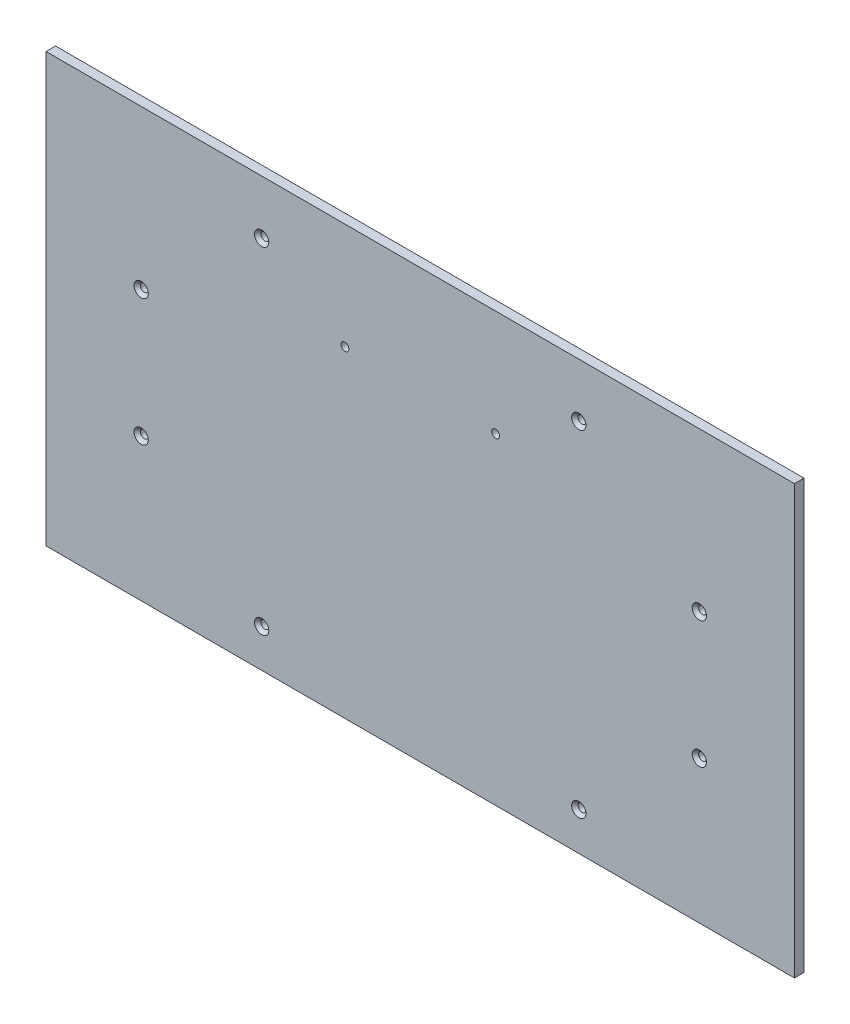
ISO-10303-21;
HEADER;
FILE_DESCRIPTION(('STEP AP214'),'2;1');
FILE_NAME('part.step','',(''),(''),'','','');
FILE_SCHEMA(('AUTOMOTIVE_DESIGN { 1 0 10303 214 1 1 1 1 }'));
ENDSEC;
DATA;
#1=APPLICATION_CONTEXT('core data for automotive mechanical design processes');
#2=APPLICATION_PROTOCOL_DEFINITION('international standard','automotive_design',2000,#1);
#3=PRODUCT_CONTEXT('',#1,'mechanical');
#4=PRODUCT('Part','Part','',(#3));
#5=PRODUCT_RELATED_PRODUCT_CATEGORY('part','',(#4));
#6=PRODUCT_DEFINITION_FORMATION('','',#4);
#7=PRODUCT_DEFINITION_CONTEXT('part definition',#1,'design');
#8=PRODUCT_DEFINITION('design','',#6,#7);
#9=PRODUCT_DEFINITION_SHAPE('','',#8);
#10=(LENGTH_UNIT() NAMED_UNIT(*) SI_UNIT(.MILLI.,.METRE.));
#11=(NAMED_UNIT(*) PLANE_ANGLE_UNIT() SI_UNIT($,.RADIAN.));
#12=(NAMED_UNIT(*) SI_UNIT($,.STERADIAN.) SOLID_ANGLE_UNIT());
#13=UNCERTAINTY_MEASURE_WITH_UNIT(LENGTH_MEASURE(1.E-05),#10,'distance_accuracy_value','');
#14=(GEOMETRIC_REPRESENTATION_CONTEXT(3) GLOBAL_UNCERTAINTY_ASSIGNED_CONTEXT((#13)) GLOBAL_UNIT_ASSIGNED_CONTEXT((#10,
#11,#12)) REPRESENTATION_CONTEXT('',''));
#15=CARTESIAN_POINT('',(0.,0.,0.));
#16=DIRECTION('',(0.,0.,1.));
#17=DIRECTION('',(1.,0.,0.));
#18=AXIS2_PLACEMENT_3D('',#15,#16,#17);
#19=CARTESIAN_POINT('',(236.,-135.,6.));
#20=DIRECTION('',(-1.,0.,0.));
#21=DIRECTION('',(0.,0.,1.));
#22=AXIS2_PLACEMENT_3D('',#19,#20,#21);
#23=PLANE('',#22);
#24=DIRECTION('',(0.,1.,0.));
#25=VECTOR('',#24,1.);
#26=CARTESIAN_POINT('',(236.,-135.,0.));
#27=LINE('',#26,#25);
#28=CARTESIAN_POINT('',(236.,-135.,0.));
#29=VERTEX_POINT('',#28);
#30=CARTESIAN_POINT('',(236.,135.,0.));
#31=VERTEX_POINT('',#30);
#32=EDGE_CURVE('E119',#29,#31,#27,.T.);
#33=ORIENTED_EDGE('',*,*,#32,.T.);
#34=DIRECTION('',(0.,0.,-1.));
#35=VECTOR('',#34,1.);
#36=CARTESIAN_POINT('',(236.,135.,6.));
#37=LINE('',#36,#35);
#38=CARTESIAN_POINT('',(236.,135.,6.));
#39=VERTEX_POINT('',#38);
#40=EDGE_CURVE('E107',#39,#31,#37,.T.);
#41=ORIENTED_EDGE('',*,*,#40,.F.);
#42=DIRECTION('',(0.,1.,0.));
#43=VECTOR('',#42,1.);
#44=CARTESIAN_POINT('',(236.,-135.,6.));
#45=LINE('',#44,#43);
#46=CARTESIAN_POINT('',(236.,-135.,6.));
#47=VERTEX_POINT('',#46);
#48=EDGE_CURVE('E99',#47,#39,#45,.T.);
#49=ORIENTED_EDGE('',*,*,#48,.F.);
#50=DIRECTION('',(0.,0.,-1.));
#51=VECTOR('',#50,1.);
#52=CARTESIAN_POINT('',(236.,-135.,6.));
#53=LINE('',#52,#51);
#54=EDGE_CURVE('E115',#47,#29,#53,.T.);
#55=ORIENTED_EDGE('',*,*,#54,.T.);
#56=EDGE_LOOP('',(#33,#41,#49,#55));
#57=FACE_BOUND('',#56,.T.);
#58=ADVANCED_FACE('F44',(#57),#23,.F.);
#59=CARTESIAN_POINT('',(-236.,135.,6.));
#60=DIRECTION('',(0.,-1.,0.));
#61=DIRECTION('',(0.,0.,-1.));
#62=AXIS2_PLACEMENT_3D('',#59,#60,#61);
#63=PLANE('',#62);
#64=DIRECTION('',(-1.,0.,0.));
#65=VECTOR('',#64,1.);
#66=CARTESIAN_POINT('',(-236.,135.,0.));
#67=LINE('',#66,#65);
#68=CARTESIAN_POINT('',(-236.,135.,0.));
#69=VERTEX_POINT('',#68);
#70=EDGE_CURVE('E105',#31,#69,#67,.T.);
#71=ORIENTED_EDGE('',*,*,#70,.T.);
#72=DIRECTION('',(0.,0.,-1.));
#73=VECTOR('',#72,1.);
#74=CARTESIAN_POINT('',(-236.,135.,6.));
#75=LINE('',#74,#73);
#76=CARTESIAN_POINT('',(-236.,135.,6.));
#77=VERTEX_POINT('',#76);
#78=EDGE_CURVE('E103',#77,#69,#75,.T.);
#79=ORIENTED_EDGE('',*,*,#78,.F.);
#80=DIRECTION('',(-1.,0.,0.));
#81=VECTOR('',#80,1.);
#82=CARTESIAN_POINT('',(-236.,135.,6.));
#83=LINE('',#82,#81);
#84=EDGE_CURVE('E94',#39,#77,#83,.T.);
#85=ORIENTED_EDGE('',*,*,#84,.F.);
#86=ORIENTED_EDGE('',*,*,#40,.T.);
#87=EDGE_LOOP('',(#71,#79,#85,#86));
#88=FACE_BOUND('',#87,.T.);
#89=ADVANCED_FACE('F104',(#88),#63,.F.);
#90=CARTESIAN_POINT('',(-236.,-135.,6.));
#91=DIRECTION('',(1.,0.,0.));
#92=DIRECTION('',(0.,0.,-1.));
#93=AXIS2_PLACEMENT_3D('',#90,#91,#92);
#94=PLANE('',#93);
#95=DIRECTION('',(0.,-1.,0.));
#96=VECTOR('',#95,1.);
#97=CARTESIAN_POINT('',(-236.,-135.,0.));
#98=LINE('',#97,#96);
#99=CARTESIAN_POINT('',(-236.,-135.,0.));
#100=VERTEX_POINT('',#99);
#101=EDGE_CURVE('E80',#69,#100,#98,.T.);
#102=ORIENTED_EDGE('',*,*,#101,.T.);
#103=DIRECTION('',(0.,0.,-1.));
#104=VECTOR('',#103,1.);
#105=CARTESIAN_POINT('',(-236.,-135.,6.));
#106=LINE('',#105,#104);
#107=CARTESIAN_POINT('',(-236.,-135.,6.));
#108=VERTEX_POINT('',#107);
#109=EDGE_CURVE('E108',#108,#100,#106,.T.);
#110=ORIENTED_EDGE('',*,*,#109,.F.);
#111=DIRECTION('',(0.,-1.,0.));
#112=VECTOR('',#111,1.);
#113=CARTESIAN_POINT('',(-236.,-135.,6.));
#114=LINE('',#113,#112);
#115=EDGE_CURVE('E97',#77,#108,#114,.T.);
#116=ORIENTED_EDGE('',*,*,#115,.F.);
#117=ORIENTED_EDGE('',*,*,#78,.T.);
#118=EDGE_LOOP('',(#102,#110,#116,#117));
#119=FACE_BOUND('',#118,.T.);
#120=ADVANCED_FACE('F110',(#119),#94,.F.);
#121=CARTESIAN_POINT('',(-236.,-135.,6.));
#122=DIRECTION('',(0.,1.,0.));
#123=DIRECTION('',(0.,0.,1.));
#124=AXIS2_PLACEMENT_3D('',#121,#122,#123);
#125=PLANE('',#124);
#126=DIRECTION('',(1.,0.,0.));
#127=VECTOR('',#126,1.);
#128=CARTESIAN_POINT('',(-236.,-135.,0.));
#129=LINE('',#128,#127);
#130=EDGE_CURVE('E86',#100,#29,#129,.T.);
#131=ORIENTED_EDGE('',*,*,#130,.T.);
#132=ORIENTED_EDGE('',*,*,#54,.F.);
#133=DIRECTION('',(1.,0.,0.));
#134=VECTOR('',#133,1.);
#135=CARTESIAN_POINT('',(-236.,-135.,6.));
#136=LINE('',#135,#134);
#137=EDGE_CURVE('E63',#108,#47,#136,.T.);
#138=ORIENTED_EDGE('',*,*,#137,.F.);
#139=ORIENTED_EDGE('',*,*,#109,.T.);
#140=EDGE_LOOP('',(#131,#132,#138,#139));
#141=FACE_BOUND('',#140,.T.);
#142=ADVANCED_FACE('F347',(#141),#125,.F.);
#143=CARTESIAN_POINT('',(0.,0.,6.));
#144=DIRECTION('',(0.,0.,-1.));
#145=DIRECTION('',(-1.,0.,0.));
#146=AXIS2_PLACEMENT_3D('',#143,#144,#145);
#147=PLANE('',#146);
#148=CARTESIAN_POINT('',(-47.5,68.,6.));
#149=DIRECTION('',(0.,0.,1.));
#150=DIRECTION('',(1.,0.,0.));
#151=AXIS2_PLACEMENT_3D('',#148,#149,#150);
#152=CIRCLE('',#151,2.5);
#153=CARTESIAN_POINT('',(-45.,68.,6.));
#154=VERTEX_POINT('',#153);
#155=EDGE_CURVE('E330',#154,#154,#152,.T.);
#156=ORIENTED_EDGE('',*,*,#155,.F.);
#157=EDGE_LOOP('',(#156));
#158=FACE_BOUND('',#157,.T.);
#159=CARTESIAN_POINT('',(47.5,68.,6.));
#160=DIRECTION('',(0.,0.,1.));
#161=DIRECTION('',(1.,0.,0.));
#162=AXIS2_PLACEMENT_3D('',#159,#160,#161);
#163=CIRCLE('',#162,2.5);
#164=CARTESIAN_POINT('',(50.,68.,6.));
#165=VERTEX_POINT('',#164);
#166=EDGE_CURVE('E327',#165,#165,#163,.T.);
#167=ORIENTED_EDGE('',*,*,#166,.F.);
#168=EDGE_LOOP('',(#167));
#169=FACE_BOUND('',#168,.T.);
#170=CARTESIAN_POINT('',(-176.,35.,6.));
#171=DIRECTION('',(0.,0.,-1.));
#172=DIRECTION('',(-1.,0.,0.));
#173=AXIS2_PLACEMENT_3D('',#170,#171,#172);
#174=CIRCLE('',#173,4.49999999999995);
#175=CARTESIAN_POINT('',(-180.5,35.,6.));
#176=VERTEX_POINT('',#175);
#177=EDGE_CURVE('E168',#176,#176,#174,.T.);
#178=ORIENTED_EDGE('',*,*,#177,.T.);
#179=EDGE_LOOP('',(#178));
#180=FACE_BOUND('',#179,.T.);
#181=CARTESIAN_POINT('',(-176.,-45.,6.));
#182=DIRECTION('',(0.,0.,-1.));
#183=DIRECTION('',(-1.,0.,0.));
#184=AXIS2_PLACEMENT_3D('',#181,#182,#183);
#185=CIRCLE('',#184,4.49999999999995);
#186=CARTESIAN_POINT('',(-180.5,-45.,6.));
#187=VERTEX_POINT('',#186);
#188=EDGE_CURVE('E164',#187,#187,#185,.T.);
#189=ORIENTED_EDGE('',*,*,#188,.T.);
#190=EDGE_LOOP('',(#189));
#191=FACE_BOUND('',#190,.T.);
#192=CARTESIAN_POINT('',(-99.9999999999999,-111.,6.));
#193=DIRECTION('',(0.,0.,-1.));
#194=DIRECTION('',(-1.,0.,0.));
#195=AXIS2_PLACEMENT_3D('',#192,#193,#194);
#196=CIRCLE('',#195,4.49999999999995);
#197=CARTESIAN_POINT('',(-104.5,-111.,6.));
#198=VERTEX_POINT('',#197);
#199=EDGE_CURVE('E160',#198,#198,#196,.T.);
#200=ORIENTED_EDGE('',*,*,#199,.T.);
#201=EDGE_LOOP('',(#200));
#202=FACE_BOUND('',#201,.T.);
#203=CARTESIAN_POINT('',(100.,-111.,6.));
#204=DIRECTION('',(0.,0.,-1.));
#205=DIRECTION('',(-1.,0.,0.));
#206=AXIS2_PLACEMENT_3D('',#203,#204,#205);
#207=CIRCLE('',#206,4.49999999999995);
#208=CARTESIAN_POINT('',(95.5000000000001,-111.,6.));
#209=VERTEX_POINT('',#208);
#210=EDGE_CURVE('E156',#209,#209,#207,.T.);
#211=ORIENTED_EDGE('',*,*,#210,.T.);
#212=EDGE_LOOP('',(#211));
#213=FACE_BOUND('',#212,.T.);
#214=CARTESIAN_POINT('',(176.,-45.,6.));
#215=DIRECTION('',(0.,0.,-1.));
#216=DIRECTION('',(-1.,0.,0.));
#217=AXIS2_PLACEMENT_3D('',#214,#215,#216);
#218=CIRCLE('',#217,4.49999999999995);
#219=CARTESIAN_POINT('',(171.5,-45.,6.));
#220=VERTEX_POINT('',#219);
#221=EDGE_CURVE('E152',#220,#220,#218,.T.);
#222=ORIENTED_EDGE('',*,*,#221,.T.);
#223=EDGE_LOOP('',(#222));
#224=FACE_BOUND('',#223,.T.);
#225=CARTESIAN_POINT('',(176.,35.,6.));
#226=DIRECTION('',(0.,0.,-1.));
#227=DIRECTION('',(-1.,0.,0.));
#228=AXIS2_PLACEMENT_3D('',#225,#226,#227);
#229=CIRCLE('',#228,4.49999999999995);
#230=CARTESIAN_POINT('',(171.5,35.,6.));
#231=VERTEX_POINT('',#230);
#232=EDGE_CURVE('E148',#231,#231,#229,.T.);
#233=ORIENTED_EDGE('',*,*,#232,.T.);
#234=EDGE_LOOP('',(#233));
#235=FACE_BOUND('',#234,.T.);
#236=CARTESIAN_POINT('',(100.,101.,6.));
#237=DIRECTION('',(0.,0.,-1.));
#238=DIRECTION('',(-1.,0.,0.));
#239=AXIS2_PLACEMENT_3D('',#236,#237,#238);
#240=CIRCLE('',#239,4.49999999999995);
#241=CARTESIAN_POINT('',(95.5000000000001,101.,6.));
#242=VERTEX_POINT('',#241);
#243=EDGE_CURVE('E144',#242,#242,#240,.T.);
#244=ORIENTED_EDGE('',*,*,#243,.T.);
#245=EDGE_LOOP('',(#244));
#246=FACE_BOUND('',#245,.T.);
#247=CARTESIAN_POINT('',(-100.,101.,6.));
#248=DIRECTION('',(0.,0.,-1.));
#249=DIRECTION('',(-1.,0.,0.));
#250=AXIS2_PLACEMENT_3D('',#247,#248,#249);
#251=CIRCLE('',#250,4.49999999999995);
#252=CARTESIAN_POINT('',(-104.5,101.,6.));
#253=VERTEX_POINT('',#252);
#254=EDGE_CURVE('E140',#253,#253,#251,.T.);
#255=ORIENTED_EDGE('',*,*,#254,.T.);
#256=EDGE_LOOP('',(#255));
#257=FACE_BOUND('',#256,.T.);
#258=ORIENTED_EDGE('',*,*,#48,.T.);
#259=ORIENTED_EDGE('',*,*,#84,.T.);
#260=ORIENTED_EDGE('',*,*,#115,.T.);
#261=ORIENTED_EDGE('',*,*,#137,.T.);
#262=EDGE_LOOP('',(#258,#259,#260,#261));
#263=FACE_BOUND('',#262,.T.);
#264=ADVANCED_FACE('F95',(#158,#169,#180,#191,#202,#213,#224,#235,#246,#257,#263),#147,.F.);
#265=CARTESIAN_POINT('',(0.,0.,0.));
#266=DIRECTION('',(0.,0.,-1.));
#267=DIRECTION('',(-1.,0.,0.));
#268=AXIS2_PLACEMENT_3D('',#265,#266,#267);
#269=PLANE('',#268);
#270=CARTESIAN_POINT('',(-47.5,68.,0.));
#271=DIRECTION('',(0.,0.,1.));
#272=DIRECTION('',(1.,0.,0.));
#273=AXIS2_PLACEMENT_3D('',#270,#271,#272);
#274=CIRCLE('',#273,2.5);
#275=CARTESIAN_POINT('',(-45.,68.,0.));
#276=VERTEX_POINT('',#275);
#277=EDGE_CURVE('E306',#276,#276,#274,.T.);
#278=ORIENTED_EDGE('',*,*,#277,.T.);
#279=EDGE_LOOP('',(#278));
#280=FACE_BOUND('',#279,.T.);
#281=CARTESIAN_POINT('',(47.5,68.,0.));
#282=DIRECTION('',(0.,0.,1.));
#283=DIRECTION('',(1.,0.,0.));
#284=AXIS2_PLACEMENT_3D('',#281,#282,#283);
#285=CIRCLE('',#284,2.5);
#286=CARTESIAN_POINT('',(50.,68.,0.));
#287=VERTEX_POINT('',#286);
#288=EDGE_CURVE('E324',#287,#287,#285,.T.);
#289=ORIENTED_EDGE('',*,*,#288,.T.);
#290=EDGE_LOOP('',(#289));
#291=FACE_BOUND('',#290,.T.);
#292=CARTESIAN_POINT('',(-176.,35.,0.));
#293=DIRECTION('',(0.,0.,1.));
#294=DIRECTION('',(1.,0.,0.));
#295=AXIS2_PLACEMENT_3D('',#292,#293,#294);
#296=CIRCLE('',#295,2.5);
#297=CARTESIAN_POINT('',(-173.5,35.,0.));
#298=VERTEX_POINT('',#297);
#299=EDGE_CURVE('E302',#298,#298,#296,.T.);
#300=ORIENTED_EDGE('',*,*,#299,.T.);
#301=EDGE_LOOP('',(#300));
#302=FACE_BOUND('',#301,.T.);
#303=CARTESIAN_POINT('',(-176.,-45.,0.));
#304=DIRECTION('',(0.,0.,1.));
#305=DIRECTION('',(1.,0.,0.));
#306=AXIS2_PLACEMENT_3D('',#303,#304,#305);
#307=CIRCLE('',#306,2.5);
#308=CARTESIAN_POINT('',(-173.5,-45.,0.));
#309=VERTEX_POINT('',#308);
#310=EDGE_CURVE('E298',#309,#309,#307,.T.);
#311=ORIENTED_EDGE('',*,*,#310,.T.);
#312=EDGE_LOOP('',(#311));
#313=FACE_BOUND('',#312,.T.);
#314=CARTESIAN_POINT('',(-99.9999999999999,-111.,0.));
#315=DIRECTION('',(0.,0.,1.));
#316=DIRECTION('',(1.,0.,0.));
#317=AXIS2_PLACEMENT_3D('',#314,#315,#316);
#318=CIRCLE('',#317,2.5);
#319=CARTESIAN_POINT('',(-97.4999999999999,-111.,0.));
#320=VERTEX_POINT('',#319);
#321=EDGE_CURVE('E291',#320,#320,#318,.T.);
#322=ORIENTED_EDGE('',*,*,#321,.T.);
#323=EDGE_LOOP('',(#322));
#324=FACE_BOUND('',#323,.T.);
#325=CARTESIAN_POINT('',(100.,-111.,0.));
#326=DIRECTION('',(0.,0.,1.));
#327=DIRECTION('',(1.,0.,0.));
#328=AXIS2_PLACEMENT_3D('',#325,#326,#327);
#329=CIRCLE('',#328,2.5);
#330=CARTESIAN_POINT('',(102.5,-111.,0.));
#331=VERTEX_POINT('',#330);
#332=EDGE_CURVE('E282',#331,#331,#329,.T.);
#333=ORIENTED_EDGE('',*,*,#332,.T.);
#334=EDGE_LOOP('',(#333));
#335=FACE_BOUND('',#334,.T.);
#336=CARTESIAN_POINT('',(176.,-45.,0.));
#337=DIRECTION('',(0.,0.,1.));
#338=DIRECTION('',(1.,0.,0.));
#339=AXIS2_PLACEMENT_3D('',#336,#337,#338);
#340=CIRCLE('',#339,2.5);
#341=CARTESIAN_POINT('',(178.5,-45.,0.));
#342=VERTEX_POINT('',#341);
#343=EDGE_CURVE('E278',#342,#342,#340,.T.);
#344=ORIENTED_EDGE('',*,*,#343,.T.);
#345=EDGE_LOOP('',(#344));
#346=FACE_BOUND('',#345,.T.);
#347=CARTESIAN_POINT('',(176.,35.,0.));
#348=DIRECTION('',(0.,0.,1.));
#349=DIRECTION('',(1.,0.,0.));
#350=AXIS2_PLACEMENT_3D('',#347,#348,#349);
#351=CIRCLE('',#350,2.5);
#352=CARTESIAN_POINT('',(178.5,35.,0.));
#353=VERTEX_POINT('',#352);
#354=EDGE_CURVE('E281',#353,#353,#351,.T.);
#355=ORIENTED_EDGE('',*,*,#354,.T.);
#356=EDGE_LOOP('',(#355));
#357=FACE_BOUND('',#356,.T.);
#358=CARTESIAN_POINT('',(100.,101.,0.));
#359=DIRECTION('',(0.,0.,1.));
#360=DIRECTION('',(1.,0.,0.));
#361=AXIS2_PLACEMENT_3D('',#358,#359,#360);
#362=CIRCLE('',#361,2.5);
#363=CARTESIAN_POINT('',(102.5,101.,0.));
#364=VERTEX_POINT('',#363);
#365=EDGE_CURVE('E288',#364,#364,#362,.T.);
#366=ORIENTED_EDGE('',*,*,#365,.T.);
#367=EDGE_LOOP('',(#366));
#368=FACE_BOUND('',#367,.T.);
#369=CARTESIAN_POINT('',(-100.,101.,0.));
#370=DIRECTION('',(0.,0.,1.));
#371=DIRECTION('',(1.,0.,0.));
#372=AXIS2_PLACEMENT_3D('',#369,#370,#371);
#373=CIRCLE('',#372,2.5);
#374=CARTESIAN_POINT('',(-97.5,101.,0.));
#375=VERTEX_POINT('',#374);
#376=EDGE_CURVE('E123',#375,#375,#373,.T.);
#377=ORIENTED_EDGE('',*,*,#376,.T.);
#378=EDGE_LOOP('',(#377));
#379=FACE_BOUND('',#378,.T.);
#380=ORIENTED_EDGE('',*,*,#32,.F.);
#381=ORIENTED_EDGE('',*,*,#130,.F.);
#382=ORIENTED_EDGE('',*,*,#101,.F.);
#383=ORIENTED_EDGE('',*,*,#70,.F.);
#384=EDGE_LOOP('',(#380,#381,#382,#383));
#385=FACE_BOUND('',#384,.T.);
#386=ADVANCED_FACE('F336',(#280,#291,#302,#313,#324,#335,#346,#357,#368,#379,#385),#269,.T.);
#387=CARTESIAN_POINT('',(-100.,101.,0.));
#388=DIRECTION('',(0.,0.,1.));
#389=DIRECTION('',(1.,0.,0.));
#390=AXIS2_PLACEMENT_3D('',#387,#388,#389);
#391=CYLINDRICAL_SURFACE('',#390,2.5);
#392=CARTESIAN_POINT('',(-100.,101.,4.00000000000004));
#393=DIRECTION('',(0.,0.,-1.));
#394=DIRECTION('',(-1.,0.,0.));
#395=AXIS2_PLACEMENT_3D('',#392,#393,#394);
#396=CIRCLE('',#395,2.5);
#397=CARTESIAN_POINT('',(-102.5,101.,4.00000000000004));
#398=VERTEX_POINT('',#397);
#399=EDGE_CURVE('E11',#398,#398,#396,.F.);
#400=ORIENTED_EDGE('',*,*,#399,.T.);
#401=EDGE_LOOP('',(#400));
#402=FACE_BOUND('',#401,.T.);
#403=ORIENTED_EDGE('',*,*,#376,.F.);
#404=EDGE_LOOP('',(#403));
#405=FACE_BOUND('',#404,.T.);
#406=ADVANCED_FACE('F367',(#402,#405),#391,.F.);
#407=CARTESIAN_POINT('',(100.,101.,0.));
#408=DIRECTION('',(0.,0.,1.));
#409=DIRECTION('',(1.,0.,0.));
#410=AXIS2_PLACEMENT_3D('',#407,#408,#409);
#411=CYLINDRICAL_SURFACE('',#410,2.5);
#412=CARTESIAN_POINT('',(100.,101.,4.00000000000004));
#413=DIRECTION('',(0.,0.,-1.));
#414=DIRECTION('',(-1.,0.,0.));
#415=AXIS2_PLACEMENT_3D('',#412,#413,#414);
#416=CIRCLE('',#415,2.5);
#417=CARTESIAN_POINT('',(97.5,101.,4.00000000000004));
#418=VERTEX_POINT('',#417);
#419=EDGE_CURVE('E55',#418,#418,#416,.F.);
#420=ORIENTED_EDGE('',*,*,#419,.T.);
#421=EDGE_LOOP('',(#420));
#422=FACE_BOUND('',#421,.T.);
#423=ORIENTED_EDGE('',*,*,#365,.F.);
#424=EDGE_LOOP('',(#423));
#425=FACE_BOUND('',#424,.T.);
#426=ADVANCED_FACE('F196',(#422,#425),#411,.F.);
#427=CARTESIAN_POINT('',(176.,35.,0.));
#428=DIRECTION('',(0.,0.,1.));
#429=DIRECTION('',(1.,0.,0.));
#430=AXIS2_PLACEMENT_3D('',#427,#428,#429);
#431=CYLINDRICAL_SURFACE('',#430,2.5);
#432=CARTESIAN_POINT('',(176.,35.,4.00000000000004));
#433=DIRECTION('',(0.,0.,-1.));
#434=DIRECTION('',(-1.,0.,0.));
#435=AXIS2_PLACEMENT_3D('',#432,#433,#434);
#436=CIRCLE('',#435,2.5);
#437=CARTESIAN_POINT('',(173.5,35.,4.00000000000004));
#438=VERTEX_POINT('',#437);
#439=EDGE_CURVE('E188',#438,#438,#436,.F.);
#440=ORIENTED_EDGE('',*,*,#439,.T.);
#441=EDGE_LOOP('',(#440));
#442=FACE_BOUND('',#441,.T.);
#443=ORIENTED_EDGE('',*,*,#354,.F.);
#444=EDGE_LOOP('',(#443));
#445=FACE_BOUND('',#444,.T.);
#446=ADVANCED_FACE('F274',(#442,#445),#431,.F.);
#447=CARTESIAN_POINT('',(176.,-45.,0.));
#448=DIRECTION('',(0.,0.,1.));
#449=DIRECTION('',(1.,0.,0.));
#450=AXIS2_PLACEMENT_3D('',#447,#448,#449);
#451=CYLINDRICAL_SURFACE('',#450,2.5);
#452=CARTESIAN_POINT('',(176.,-45.,4.00000000000004));
#453=DIRECTION('',(0.,0.,-1.));
#454=DIRECTION('',(-1.,0.,0.));
#455=AXIS2_PLACEMENT_3D('',#452,#453,#454);
#456=CIRCLE('',#455,2.5);
#457=CARTESIAN_POINT('',(173.5,-45.,4.00000000000004));
#458=VERTEX_POINT('',#457);
#459=EDGE_CURVE('E184',#458,#458,#456,.F.);
#460=ORIENTED_EDGE('',*,*,#459,.T.);
#461=EDGE_LOOP('',(#460));
#462=FACE_BOUND('',#461,.T.);
#463=ORIENTED_EDGE('',*,*,#343,.F.);
#464=EDGE_LOOP('',(#463));
#465=FACE_BOUND('',#464,.T.);
#466=ADVANCED_FACE('F270',(#462,#465),#451,.F.);
#467=CARTESIAN_POINT('',(100.,-111.,0.));
#468=DIRECTION('',(0.,0.,1.));
#469=DIRECTION('',(1.,0.,0.));
#470=AXIS2_PLACEMENT_3D('',#467,#468,#469);
#471=CYLINDRICAL_SURFACE('',#470,2.5);
#472=CARTESIAN_POINT('',(100.,-111.,4.00000000000004));
#473=DIRECTION('',(0.,0.,-1.));
#474=DIRECTION('',(-1.,0.,0.));
#475=AXIS2_PLACEMENT_3D('',#472,#473,#474);
#476=CIRCLE('',#475,2.5);
#477=CARTESIAN_POINT('',(97.5,-111.,4.00000000000004));
#478=VERTEX_POINT('',#477);
#479=EDGE_CURVE('E180',#478,#478,#476,.F.);
#480=ORIENTED_EDGE('',*,*,#479,.T.);
#481=EDGE_LOOP('',(#480));
#482=FACE_BOUND('',#481,.T.);
#483=ORIENTED_EDGE('',*,*,#332,.F.);
#484=EDGE_LOOP('',(#483));
#485=FACE_BOUND('',#484,.T.);
#486=ADVANCED_FACE('F273',(#482,#485),#471,.F.);
#487=CARTESIAN_POINT('',(-99.9999999999999,-111.,0.));
#488=DIRECTION('',(0.,0.,1.));
#489=DIRECTION('',(1.,0.,0.));
#490=AXIS2_PLACEMENT_3D('',#487,#488,#489);
#491=CYLINDRICAL_SURFACE('',#490,2.5);
#492=CARTESIAN_POINT('',(-99.9999999999999,-111.,4.00000000000004));
#493=DIRECTION('',(0.,0.,-1.));
#494=DIRECTION('',(-1.,0.,0.));
#495=AXIS2_PLACEMENT_3D('',#492,#493,#494);
#496=CIRCLE('',#495,2.5);
#497=CARTESIAN_POINT('',(-102.5,-111.,4.00000000000004));
#498=VERTEX_POINT('',#497);
#499=EDGE_CURVE('E176',#498,#498,#496,.F.);
#500=ORIENTED_EDGE('',*,*,#499,.T.);
#501=EDGE_LOOP('',(#500));
#502=FACE_BOUND('',#501,.T.);
#503=ORIENTED_EDGE('',*,*,#321,.F.);
#504=EDGE_LOOP('',(#503));
#505=FACE_BOUND('',#504,.T.);
#506=ADVANCED_FACE('F389',(#502,#505),#491,.F.);
#507=CARTESIAN_POINT('',(-176.,-45.,0.));
#508=DIRECTION('',(0.,0.,1.));
#509=DIRECTION('',(1.,0.,0.));
#510=AXIS2_PLACEMENT_3D('',#507,#508,#509);
#511=CYLINDRICAL_SURFACE('',#510,2.5);
#512=CARTESIAN_POINT('',(-176.,-45.,4.00000000000004));
#513=DIRECTION('',(0.,0.,-1.));
#514=DIRECTION('',(-1.,0.,0.));
#515=AXIS2_PLACEMENT_3D('',#512,#513,#514);
#516=CIRCLE('',#515,2.5);
#517=CARTESIAN_POINT('',(-178.5,-45.,4.00000000000004));
#518=VERTEX_POINT('',#517);
#519=EDGE_CURVE('E172',#518,#518,#516,.F.);
#520=ORIENTED_EDGE('',*,*,#519,.T.);
#521=EDGE_LOOP('',(#520));
#522=FACE_BOUND('',#521,.T.);
#523=ORIENTED_EDGE('',*,*,#310,.F.);
#524=EDGE_LOOP('',(#523));
#525=FACE_BOUND('',#524,.T.);
#526=ADVANCED_FACE('F385',(#522,#525),#511,.F.);
#527=CARTESIAN_POINT('',(-176.,35.,0.));
#528=DIRECTION('',(0.,0.,1.));
#529=DIRECTION('',(1.,0.,0.));
#530=AXIS2_PLACEMENT_3D('',#527,#528,#529);
#531=CYLINDRICAL_SURFACE('',#530,2.5);
#532=CARTESIAN_POINT('',(-176.,35.,4.00000000000004));
#533=DIRECTION('',(0.,0.,-1.));
#534=DIRECTION('',(-1.,0.,0.));
#535=AXIS2_PLACEMENT_3D('',#532,#533,#534);
#536=CIRCLE('',#535,2.5);
#537=CARTESIAN_POINT('',(-178.5,35.,4.00000000000004));
#538=VERTEX_POINT('',#537);
#539=EDGE_CURVE('E136',#538,#538,#536,.F.);
#540=ORIENTED_EDGE('',*,*,#539,.T.);
#541=EDGE_LOOP('',(#540));
#542=FACE_BOUND('',#541,.T.);
#543=ORIENTED_EDGE('',*,*,#299,.F.);
#544=EDGE_LOOP('',(#543));
#545=FACE_BOUND('',#544,.T.);
#546=ADVANCED_FACE('F231',(#542,#545),#531,.F.);
#547=CARTESIAN_POINT('',(-176.,35.,4.00000000000004));
#548=DIRECTION('',(0.,0.,1.));
#549=DIRECTION('',(1.,0.,0.));
#550=AXIS2_PLACEMENT_3D('',#547,#548,#549);
#551=CONICAL_SURFACE('',#550,2.5,0.785398163397446);
#552=ORIENTED_EDGE('',*,*,#177,.F.);
#553=EDGE_LOOP('',(#552));
#554=FACE_BOUND('',#553,.T.);
#555=ORIENTED_EDGE('',*,*,#539,.F.);
#556=EDGE_LOOP('',(#555));
#557=FACE_BOUND('',#556,.T.);
#558=ADVANCED_FACE('F224',(#554,#557),#551,.F.);
#559=CARTESIAN_POINT('',(-176.,-45.,4.00000000000004));
#560=DIRECTION('',(0.,0.,1.));
#561=DIRECTION('',(1.,0.,0.));
#562=AXIS2_PLACEMENT_3D('',#559,#560,#561);
#563=CONICAL_SURFACE('',#562,2.5,0.785398163397446);
#564=ORIENTED_EDGE('',*,*,#188,.F.);
#565=EDGE_LOOP('',(#564));
#566=FACE_BOUND('',#565,.T.);
#567=ORIENTED_EDGE('',*,*,#519,.F.);
#568=EDGE_LOOP('',(#567));
#569=FACE_BOUND('',#568,.T.);
#570=ADVANCED_FACE('F230',(#566,#569),#563,.F.);
#571=CARTESIAN_POINT('',(-99.9999999999999,-111.,4.00000000000004));
#572=DIRECTION('',(0.,0.,1.));
#573=DIRECTION('',(1.,0.,0.));
#574=AXIS2_PLACEMENT_3D('',#571,#572,#573);
#575=CONICAL_SURFACE('',#574,2.5,0.785398163397446);
#576=ORIENTED_EDGE('',*,*,#199,.F.);
#577=EDGE_LOOP('',(#576));
#578=FACE_BOUND('',#577,.T.);
#579=ORIENTED_EDGE('',*,*,#499,.F.);
#580=EDGE_LOOP('',(#579));
#581=FACE_BOUND('',#580,.T.);
#582=ADVANCED_FACE('F238',(#578,#581),#575,.F.);
#583=CARTESIAN_POINT('',(100.,-111.,4.00000000000004));
#584=DIRECTION('',(0.,0.,1.));
#585=DIRECTION('',(1.,0.,0.));
#586=AXIS2_PLACEMENT_3D('',#583,#584,#585);
#587=CONICAL_SURFACE('',#586,2.5,0.785398163397446);
#588=ORIENTED_EDGE('',*,*,#210,.F.);
#589=EDGE_LOOP('',(#588));
#590=FACE_BOUND('',#589,.T.);
#591=ORIENTED_EDGE('',*,*,#479,.F.);
#592=EDGE_LOOP('',(#591));
#593=FACE_BOUND('',#592,.T.);
#594=ADVANCED_FACE('F245',(#590,#593),#587,.F.);
#595=CARTESIAN_POINT('',(176.,-45.,4.00000000000004));
#596=DIRECTION('',(0.,0.,1.));
#597=DIRECTION('',(1.,0.,0.));
#598=AXIS2_PLACEMENT_3D('',#595,#596,#597);
#599=CONICAL_SURFACE('',#598,2.5,0.785398163397446);
#600=ORIENTED_EDGE('',*,*,#221,.F.);
#601=EDGE_LOOP('',(#600));
#602=FACE_BOUND('',#601,.T.);
#603=ORIENTED_EDGE('',*,*,#459,.F.);
#604=EDGE_LOOP('',(#603));
#605=FACE_BOUND('',#604,.T.);
#606=ADVANCED_FACE('F209',(#602,#605),#599,.F.);
#607=CARTESIAN_POINT('',(176.,35.,4.00000000000004));
#608=DIRECTION('',(0.,0.,1.));
#609=DIRECTION('',(1.,0.,0.));
#610=AXIS2_PLACEMENT_3D('',#607,#608,#609);
#611=CONICAL_SURFACE('',#610,2.5,0.785398163397446);
#612=ORIENTED_EDGE('',*,*,#232,.F.);
#613=EDGE_LOOP('',(#612));
#614=FACE_BOUND('',#613,.T.);
#615=ORIENTED_EDGE('',*,*,#439,.F.);
#616=EDGE_LOOP('',(#615));
#617=FACE_BOUND('',#616,.T.);
#618=ADVANCED_FACE('F201',(#614,#617),#611,.F.);
#619=CARTESIAN_POINT('',(100.,101.,4.00000000000004));
#620=DIRECTION('',(0.,0.,1.));
#621=DIRECTION('',(1.,0.,0.));
#622=AXIS2_PLACEMENT_3D('',#619,#620,#621);
#623=CONICAL_SURFACE('',#622,2.5,0.785398163397446);
#624=ORIENTED_EDGE('',*,*,#243,.F.);
#625=EDGE_LOOP('',(#624));
#626=FACE_BOUND('',#625,.T.);
#627=ORIENTED_EDGE('',*,*,#419,.F.);
#628=EDGE_LOOP('',(#627));
#629=FACE_BOUND('',#628,.T.);
#630=ADVANCED_FACE('F199',(#626,#629),#623,.F.);
#631=CARTESIAN_POINT('',(-100.,101.,4.00000000000004));
#632=DIRECTION('',(0.,0.,1.));
#633=DIRECTION('',(1.,0.,0.));
#634=AXIS2_PLACEMENT_3D('',#631,#632,#633);
#635=CONICAL_SURFACE('',#634,2.5,0.785398163397446);
#636=ORIENTED_EDGE('',*,*,#254,.F.);
#637=EDGE_LOOP('',(#636));
#638=FACE_BOUND('',#637,.T.);
#639=ORIENTED_EDGE('',*,*,#399,.F.);
#640=EDGE_LOOP('',(#639));
#641=FACE_BOUND('',#640,.T.);
#642=ADVANCED_FACE('F47',(#638,#641),#635,.F.);
#643=CARTESIAN_POINT('',(47.5,68.,0.));
#644=DIRECTION('',(0.,0.,1.));
#645=DIRECTION('',(1.,0.,0.));
#646=AXIS2_PLACEMENT_3D('',#643,#644,#645);
#647=CYLINDRICAL_SURFACE('',#646,2.5);
#648=ORIENTED_EDGE('',*,*,#288,.F.);
#649=EDGE_LOOP('',(#648));
#650=FACE_BOUND('',#649,.T.);
#651=ORIENTED_EDGE('',*,*,#166,.T.);
#652=EDGE_LOOP('',(#651));
#653=FACE_BOUND('',#652,.T.);
#654=ADVANCED_FACE('F207',(#650,#653),#647,.F.);
#655=CARTESIAN_POINT('',(-47.5,68.,0.));
#656=DIRECTION('',(0.,0.,1.));
#657=DIRECTION('',(1.,0.,0.));
#658=AXIS2_PLACEMENT_3D('',#655,#656,#657);
#659=CYLINDRICAL_SURFACE('',#658,2.5);
#660=ORIENTED_EDGE('',*,*,#277,.F.);
#661=EDGE_LOOP('',(#660));
#662=FACE_BOUND('',#661,.T.);
#663=ORIENTED_EDGE('',*,*,#155,.T.);
#664=EDGE_LOOP('',(#663));
#665=FACE_BOUND('',#664,.T.);
#666=ADVANCED_FACE('F339',(#662,#665),#659,.F.);
#667=CLOSED_SHELL('',(#58,#89,#120,#142,#264,#386,#406,#426,#446,#466,#486,#506,#526,#546,#558,
#570,#582,#594,#606,#618,#630,#642,#654,#666));
#668=MANIFOLD_SOLID_BREP('B2',#667);
#669=ADVANCED_BREP_SHAPE_REPRESENTATION('',(#18,#668),#14);
#670=SHAPE_DEFINITION_REPRESENTATION(#9,#669);
ENDSEC;
END-ISO-10303-21;
